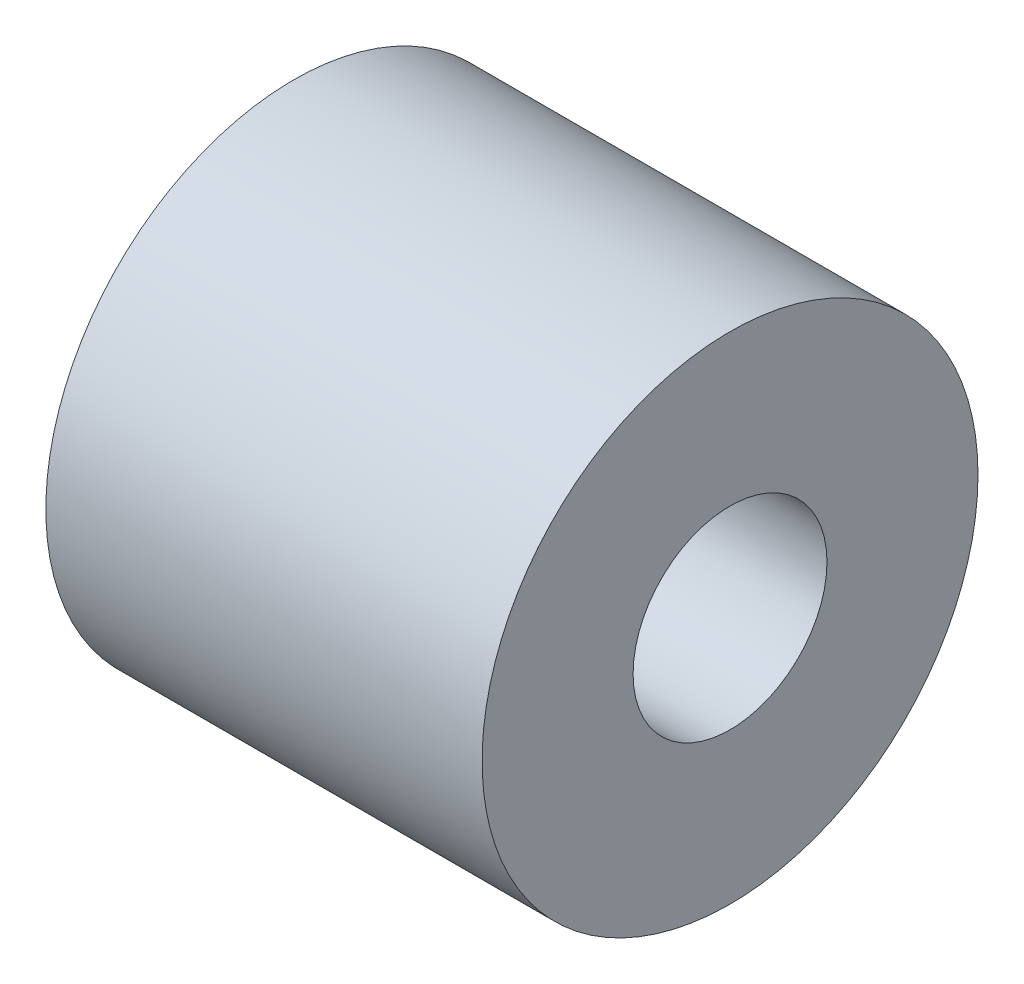
ISO-10303-21;
HEADER;
FILE_DESCRIPTION(('STEP AP214'),'2;1');
FILE_NAME('part.step','',(''),(''),'','','');
FILE_SCHEMA(('AUTOMOTIVE_DESIGN { 1 0 10303 214 1 1 1 1 }'));
ENDSEC;
DATA;
#1=APPLICATION_CONTEXT('core data for automotive mechanical design processes');
#2=APPLICATION_PROTOCOL_DEFINITION('international standard','automotive_design',2000,#1);
#3=PRODUCT_CONTEXT('',#1,'mechanical');
#4=PRODUCT('Part','Part','',(#3));
#5=PRODUCT_RELATED_PRODUCT_CATEGORY('part','',(#4));
#6=PRODUCT_DEFINITION_FORMATION('','',#4);
#7=PRODUCT_DEFINITION_CONTEXT('part definition',#1,'design');
#8=PRODUCT_DEFINITION('design','',#6,#7);
#9=PRODUCT_DEFINITION_SHAPE('','',#8);
#10=(LENGTH_UNIT() NAMED_UNIT(*) SI_UNIT(.MILLI.,.METRE.));
#11=(NAMED_UNIT(*) PLANE_ANGLE_UNIT() SI_UNIT($,.RADIAN.));
#12=(NAMED_UNIT(*) SI_UNIT($,.STERADIAN.) SOLID_ANGLE_UNIT());
#13=UNCERTAINTY_MEASURE_WITH_UNIT(LENGTH_MEASURE(1.E-05),#10,'distance_accuracy_value','');
#14=(GEOMETRIC_REPRESENTATION_CONTEXT(3) GLOBAL_UNCERTAINTY_ASSIGNED_CONTEXT((#13)) GLOBAL_UNIT_ASSIGNED_CONTEXT((#10,
#11,#12)) REPRESENTATION_CONTEXT('',''));
#15=CARTESIAN_POINT('',(0.,0.,0.));
#16=DIRECTION('',(0.,0.,1.));
#17=DIRECTION('',(1.,0.,0.));
#18=AXIS2_PLACEMENT_3D('',#15,#16,#17);
#19=CARTESIAN_POINT('',(11.7,0.,0.));
#20=DIRECTION('',(1.,0.,0.));
#21=DIRECTION('',(0.,0.,-1.));
#22=AXIS2_PLACEMENT_3D('',#19,#20,#21);
#23=PLANE('',#22);
#24=CARTESIAN_POINT('',(11.7,0.,0.));
#25=DIRECTION('',(1.,0.,0.));
#26=DIRECTION('',(0.,0.,-1.));
#27=AXIS2_PLACEMENT_3D('',#24,#25,#26);
#28=CIRCLE('',#27,6.65);
#29=CARTESIAN_POINT('',(11.7,0.,-6.65));
#30=VERTEX_POINT('',#29);
#31=EDGE_CURVE('E10',#30,#30,#28,.T.);
#32=ORIENTED_EDGE('',*,*,#31,.T.);
#33=EDGE_LOOP('',(#32));
#34=FACE_BOUND('',#33,.T.);
#35=CARTESIAN_POINT('',(11.7,0.,0.));
#36=DIRECTION('',(1.,0.,0.));
#37=DIRECTION('',(0.,0.,-1.));
#38=AXIS2_PLACEMENT_3D('',#35,#36,#37);
#39=CIRCLE('',#38,2.6);
#40=CARTESIAN_POINT('',(11.7,0.,-2.6));
#41=VERTEX_POINT('',#40);
#42=EDGE_CURVE('E48',#41,#41,#39,.T.);
#43=ORIENTED_EDGE('',*,*,#42,.F.);
#44=EDGE_LOOP('',(#43));
#45=FACE_BOUND('',#44,.T.);
#46=ADVANCED_FACE('F37',(#34,#45),#23,.T.);
#47=CARTESIAN_POINT('',(0.,0.,0.));
#48=DIRECTION('',(1.,0.,0.));
#49=DIRECTION('',(0.,0.,-1.));
#50=AXIS2_PLACEMENT_3D('',#47,#48,#49);
#51=PLANE('',#50);
#52=CARTESIAN_POINT('',(0.,0.,0.));
#53=DIRECTION('',(1.,0.,0.));
#54=DIRECTION('',(0.,0.,-1.));
#55=AXIS2_PLACEMENT_3D('',#52,#53,#54);
#56=CIRCLE('',#55,6.65);
#57=CARTESIAN_POINT('',(0.,0.,-6.65));
#58=VERTEX_POINT('',#57);
#59=EDGE_CURVE('E41',#58,#58,#56,.T.);
#60=ORIENTED_EDGE('',*,*,#59,.F.);
#61=EDGE_LOOP('',(#60));
#62=FACE_BOUND('',#61,.T.);
#63=CARTESIAN_POINT('',(0.,0.,0.));
#64=DIRECTION('',(1.,0.,0.));
#65=DIRECTION('',(0.,0.,-1.));
#66=AXIS2_PLACEMENT_3D('',#63,#64,#65);
#67=CIRCLE('',#66,2.6);
#68=CARTESIAN_POINT('',(0.,0.,-2.6));
#69=VERTEX_POINT('',#68);
#70=EDGE_CURVE('E50',#69,#69,#67,.T.);
#71=ORIENTED_EDGE('',*,*,#70,.T.);
#72=EDGE_LOOP('',(#71));
#73=FACE_BOUND('',#72,.T.);
#74=ADVANCED_FACE('F60',(#62,#73),#51,.F.);
#75=CARTESIAN_POINT('',(11.7,0.,0.));
#76=DIRECTION('',(-1.,0.,0.));
#77=DIRECTION('',(0.,0.,1.));
#78=AXIS2_PLACEMENT_3D('',#75,#76,#77);
#79=CYLINDRICAL_SURFACE('',#78,6.65);
#80=ORIENTED_EDGE('',*,*,#31,.F.);
#81=EDGE_LOOP('',(#80));
#82=FACE_BOUND('',#81,.T.);
#83=ORIENTED_EDGE('',*,*,#59,.T.);
#84=EDGE_LOOP('',(#83));
#85=FACE_BOUND('',#84,.T.);
#86=ADVANCED_FACE('F39',(#82,#85),#79,.T.);
#87=CARTESIAN_POINT('',(11.7,0.,0.));
#88=DIRECTION('',(-1.,0.,0.));
#89=DIRECTION('',(0.,0.,1.));
#90=AXIS2_PLACEMENT_3D('',#87,#88,#89);
#91=CYLINDRICAL_SURFACE('',#90,2.6);
#92=ORIENTED_EDGE('',*,*,#42,.T.);
#93=EDGE_LOOP('',(#92));
#94=FACE_BOUND('',#93,.T.);
#95=ORIENTED_EDGE('',*,*,#70,.F.);
#96=EDGE_LOOP('',(#95));
#97=FACE_BOUND('',#96,.T.);
#98=ADVANCED_FACE('F56',(#94,#97),#91,.F.);
#99=CLOSED_SHELL('',(#46,#74,#86,#98));
#100=MANIFOLD_SOLID_BREP('B2',#99);
#101=ADVANCED_BREP_SHAPE_REPRESENTATION('',(#18,#100),#14);
#102=SHAPE_DEFINITION_REPRESENTATION(#9,#101);
ENDSEC;
END-ISO-10303-21;
